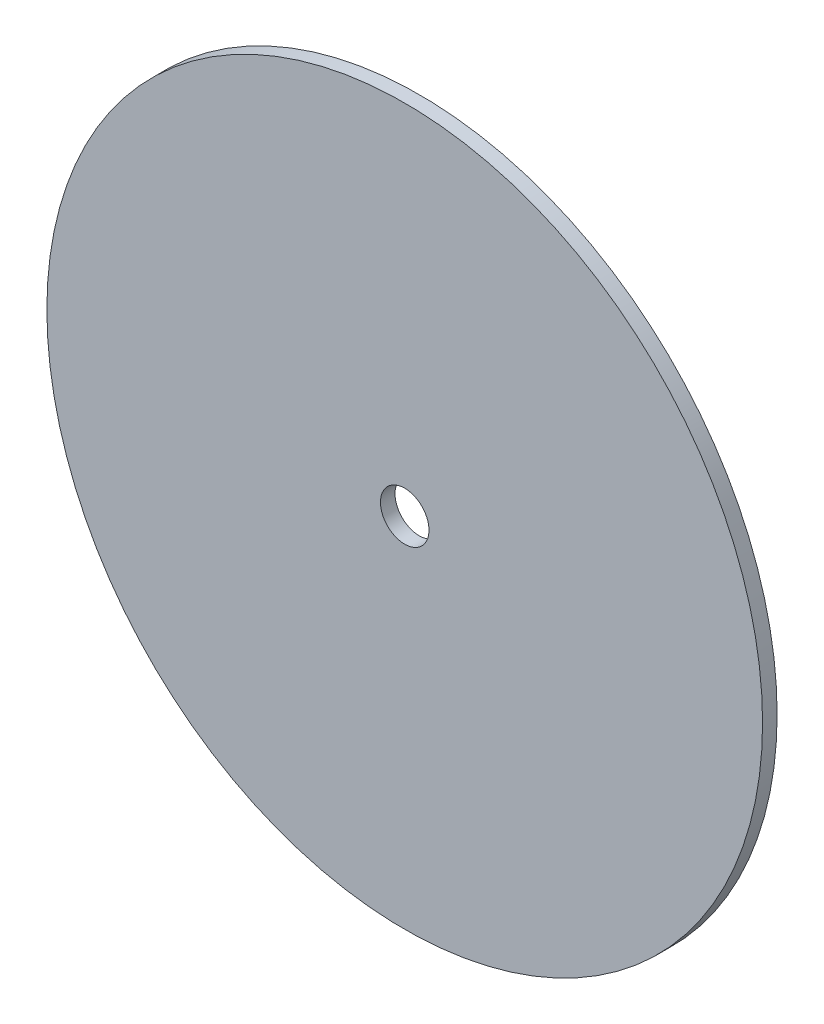
ISO-10303-21;
HEADER;
FILE_DESCRIPTION(('STEP AP214'),'2;1');
FILE_NAME('part.step','',(''),(''),'','','');
FILE_SCHEMA(('AUTOMOTIVE_DESIGN { 1 0 10303 214 1 1 1 1 }'));
ENDSEC;
DATA;
#1=APPLICATION_CONTEXT('core data for automotive mechanical design processes');
#2=APPLICATION_PROTOCOL_DEFINITION('international standard','automotive_design',2000,#1);
#3=PRODUCT_CONTEXT('',#1,'mechanical');
#4=PRODUCT('Part','Part','',(#3));
#5=PRODUCT_RELATED_PRODUCT_CATEGORY('part','',(#4));
#6=PRODUCT_DEFINITION_FORMATION('','',#4);
#7=PRODUCT_DEFINITION_CONTEXT('part definition',#1,'design');
#8=PRODUCT_DEFINITION('design','',#6,#7);
#9=PRODUCT_DEFINITION_SHAPE('','',#8);
#10=(LENGTH_UNIT() NAMED_UNIT(*) SI_UNIT(.MILLI.,.METRE.));
#11=(NAMED_UNIT(*) PLANE_ANGLE_UNIT() SI_UNIT($,.RADIAN.));
#12=(NAMED_UNIT(*) SI_UNIT($,.STERADIAN.) SOLID_ANGLE_UNIT());
#13=UNCERTAINTY_MEASURE_WITH_UNIT(LENGTH_MEASURE(1.E-05),#10,'distance_accuracy_value','');
#14=(GEOMETRIC_REPRESENTATION_CONTEXT(3) GLOBAL_UNCERTAINTY_ASSIGNED_CONTEXT((#13)) GLOBAL_UNIT_ASSIGNED_CONTEXT((#10,
#11,#12)) REPRESENTATION_CONTEXT('',''));
#15=CARTESIAN_POINT('',(0.,0.,0.));
#16=DIRECTION('',(0.,0.,1.));
#17=DIRECTION('',(1.,0.,0.));
#18=AXIS2_PLACEMENT_3D('',#15,#16,#17);
#19=CARTESIAN_POINT('',(0.,0.,1.2));
#20=DIRECTION('',(0.,0.,-1.));
#21=DIRECTION('',(-1.,0.,0.));
#22=AXIS2_PLACEMENT_3D('',#19,#20,#21);
#23=CYLINDRICAL_SURFACE('',#22,29.5);
#24=CARTESIAN_POINT('',(0.,0.,1.2));
#25=DIRECTION('',(0.,0.,1.));
#26=DIRECTION('',(1.,0.,0.));
#27=AXIS2_PLACEMENT_3D('',#24,#25,#26);
#28=CIRCLE('',#27,29.5);
#29=CARTESIAN_POINT('',(29.5,0.,1.2));
#30=VERTEX_POINT('',#29);
#31=EDGE_CURVE('E10',#30,#30,#28,.T.);
#32=ORIENTED_EDGE('',*,*,#31,.F.);
#33=EDGE_LOOP('',(#32));
#34=FACE_BOUND('',#33,.T.);
#35=CARTESIAN_POINT('',(0.,0.,0.));
#36=DIRECTION('',(0.,0.,1.));
#37=DIRECTION('',(1.,0.,0.));
#38=AXIS2_PLACEMENT_3D('',#35,#36,#37);
#39=CIRCLE('',#38,29.5);
#40=CARTESIAN_POINT('',(29.5,0.,0.));
#41=VERTEX_POINT('',#40);
#42=EDGE_CURVE('E40',#41,#41,#39,.T.);
#43=ORIENTED_EDGE('',*,*,#42,.T.);
#44=EDGE_LOOP('',(#43));
#45=FACE_BOUND('',#44,.T.);
#46=ADVANCED_FACE('F37',(#34,#45),#23,.T.);
#47=CARTESIAN_POINT('',(0.,0.,1.2));
#48=DIRECTION('',(0.,0.,1.));
#49=DIRECTION('',(1.,0.,0.));
#50=AXIS2_PLACEMENT_3D('',#47,#48,#49);
#51=PLANE('',#50);
#52=CARTESIAN_POINT('',(0.,0.,1.2));
#53=DIRECTION('',(0.,0.,-1.));
#54=DIRECTION('',(-1.,0.,0.));
#55=AXIS2_PLACEMENT_3D('',#52,#53,#54);
#56=CIRCLE('',#55,2.);
#57=CARTESIAN_POINT('',(-2.,0.,1.2));
#58=VERTEX_POINT('',#57);
#59=EDGE_CURVE('E47',#58,#58,#56,.T.);
#60=ORIENTED_EDGE('',*,*,#59,.T.);
#61=EDGE_LOOP('',(#60));
#62=FACE_BOUND('',#61,.T.);
#63=ORIENTED_EDGE('',*,*,#31,.T.);
#64=EDGE_LOOP('',(#63));
#65=FACE_BOUND('',#64,.T.);
#66=ADVANCED_FACE('F55',(#62,#65),#51,.T.);
#67=CARTESIAN_POINT('',(0.,0.,0.));
#68=DIRECTION('',(0.,0.,1.));
#69=DIRECTION('',(1.,0.,0.));
#70=AXIS2_PLACEMENT_3D('',#67,#68,#69);
#71=PLANE('',#70);
#72=CARTESIAN_POINT('',(0.,0.,0.));
#73=DIRECTION('',(0.,0.,-1.));
#74=DIRECTION('',(-1.,0.,0.));
#75=AXIS2_PLACEMENT_3D('',#72,#73,#74);
#76=CIRCLE('',#75,2.);
#77=CARTESIAN_POINT('',(-2.,0.,0.));
#78=VERTEX_POINT('',#77);
#79=EDGE_CURVE('E49',#78,#78,#76,.T.);
#80=ORIENTED_EDGE('',*,*,#79,.F.);
#81=EDGE_LOOP('',(#80));
#82=FACE_BOUND('',#81,.T.);
#83=ORIENTED_EDGE('',*,*,#42,.F.);
#84=EDGE_LOOP('',(#83));
#85=FACE_BOUND('',#84,.T.);
#86=ADVANCED_FACE('F60',(#82,#85),#71,.F.);
#87=CARTESIAN_POINT('',(0.,0.,1.2));
#88=DIRECTION('',(0.,0.,-1.));
#89=DIRECTION('',(-1.,0.,0.));
#90=AXIS2_PLACEMENT_3D('',#87,#88,#89);
#91=CYLINDRICAL_SURFACE('',#90,2.);
#92=ORIENTED_EDGE('',*,*,#59,.F.);
#93=EDGE_LOOP('',(#92));
#94=FACE_BOUND('',#93,.T.);
#95=ORIENTED_EDGE('',*,*,#79,.T.);
#96=EDGE_LOOP('',(#95));
#97=FACE_BOUND('',#96,.T.);
#98=ADVANCED_FACE('F57',(#94,#97),#91,.F.);
#99=CLOSED_SHELL('',(#46,#66,#86,#98));
#100=MANIFOLD_SOLID_BREP('B2',#99);
#101=ADVANCED_BREP_SHAPE_REPRESENTATION('',(#18,#100),#14);
#102=SHAPE_DEFINITION_REPRESENTATION(#9,#101);
ENDSEC;
END-ISO-10303-21;
